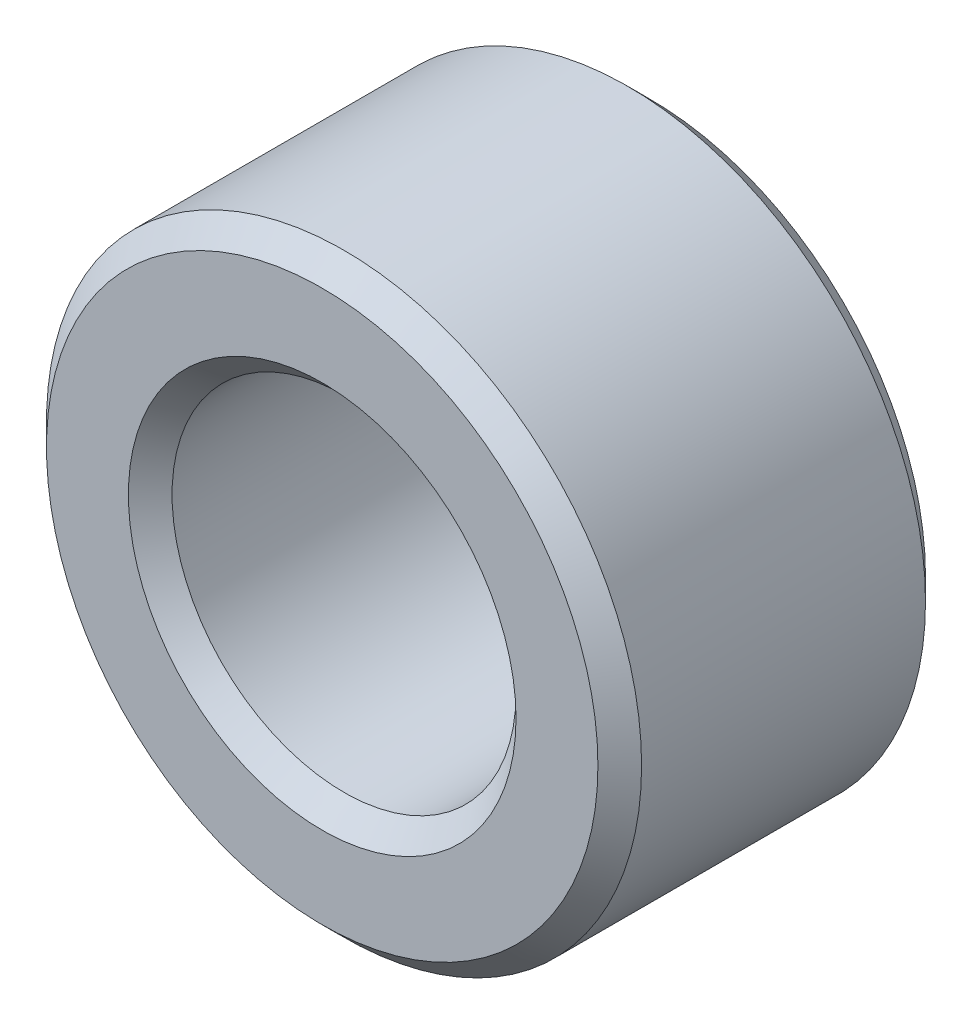
ISO-10303-21;
HEADER;
FILE_DESCRIPTION(('STEP AP214'),'2;1');
FILE_NAME('part.step','',(''),(''),'','','');
FILE_SCHEMA(('AUTOMOTIVE_DESIGN { 1 0 10303 214 1 1 1 1 }'));
ENDSEC;
DATA;
#1=APPLICATION_CONTEXT('core data for automotive mechanical design processes');
#2=APPLICATION_PROTOCOL_DEFINITION('international standard','automotive_design',2000,#1);
#3=PRODUCT_CONTEXT('',#1,'mechanical');
#4=PRODUCT('Part','Part','',(#3));
#5=PRODUCT_RELATED_PRODUCT_CATEGORY('part','',(#4));
#6=PRODUCT_DEFINITION_FORMATION('','',#4);
#7=PRODUCT_DEFINITION_CONTEXT('part definition',#1,'design');
#8=PRODUCT_DEFINITION('design','',#6,#7);
#9=PRODUCT_DEFINITION_SHAPE('','',#8);
#10=(LENGTH_UNIT() NAMED_UNIT(*) SI_UNIT(.MILLI.,.METRE.));
#11=(NAMED_UNIT(*) PLANE_ANGLE_UNIT() SI_UNIT($,.RADIAN.));
#12=(NAMED_UNIT(*) SI_UNIT($,.STERADIAN.) SOLID_ANGLE_UNIT());
#13=UNCERTAINTY_MEASURE_WITH_UNIT(LENGTH_MEASURE(1.E-05),#10,'distance_accuracy_value','');
#14=(GEOMETRIC_REPRESENTATION_CONTEXT(3) GLOBAL_UNCERTAINTY_ASSIGNED_CONTEXT((#13)) GLOBAL_UNIT_ASSIGNED_CONTEXT((#10,
#11,#12)) REPRESENTATION_CONTEXT('',''));
#15=CARTESIAN_POINT('',(0.,0.,0.));
#16=DIRECTION('',(0.,0.,1.));
#17=DIRECTION('',(1.,0.,0.));
#18=AXIS2_PLACEMENT_3D('',#15,#16,#17);
#19=CARTESIAN_POINT('',(0.,0.,3.));
#20=DIRECTION('',(0.,0.,1.));
#21=DIRECTION('',(1.,0.,0.));
#22=AXIS2_PLACEMENT_3D('',#19,#20,#21);
#23=PLANE('',#22);
#24=CARTESIAN_POINT('',(0.,0.,3.));
#25=DIRECTION('',(0.,0.,1.));
#26=DIRECTION('',(1.,0.,0.));
#27=AXIS2_PLACEMENT_3D('',#24,#25,#26);
#28=CIRCLE('',#27,1.775);
#29=CARTESIAN_POINT('',(1.775,0.,3.));
#30=VERTEX_POINT('',#29);
#31=EDGE_CURVE('E48',#30,#30,#28,.F.);
#32=ORIENTED_EDGE('',*,*,#31,.T.);
#33=EDGE_LOOP('',(#32));
#34=FACE_BOUND('',#33,.T.);
#35=CARTESIAN_POINT('',(0.,0.,3.));
#36=DIRECTION('',(0.,0.,1.));
#37=DIRECTION('',(1.,0.,0.));
#38=AXIS2_PLACEMENT_3D('',#35,#36,#37);
#39=CIRCLE('',#38,2.525);
#40=CARTESIAN_POINT('',(2.525,0.,3.));
#41=VERTEX_POINT('',#40);
#42=EDGE_CURVE('E52',#41,#41,#39,.T.);
#43=ORIENTED_EDGE('',*,*,#42,.T.);
#44=EDGE_LOOP('',(#43));
#45=FACE_BOUND('',#44,.T.);
#46=ADVANCED_FACE('F36',(#34,#45),#23,.T.);
#47=CARTESIAN_POINT('',(0.,0.,0.));
#48=DIRECTION('',(0.,0.,1.));
#49=DIRECTION('',(1.,0.,0.));
#50=AXIS2_PLACEMENT_3D('',#47,#48,#49);
#51=PLANE('',#50);
#52=CARTESIAN_POINT('',(0.,0.,0.));
#53=DIRECTION('',(0.,0.,1.));
#54=DIRECTION('',(1.,0.,0.));
#55=AXIS2_PLACEMENT_3D('',#52,#53,#54);
#56=CIRCLE('',#55,1.775);
#57=CARTESIAN_POINT('',(1.775,0.,0.));
#58=VERTEX_POINT('',#57);
#59=EDGE_CURVE('E63',#58,#58,#56,.T.);
#60=ORIENTED_EDGE('',*,*,#59,.T.);
#61=EDGE_LOOP('',(#60));
#62=FACE_BOUND('',#61,.T.);
#63=CARTESIAN_POINT('',(0.,0.,0.));
#64=DIRECTION('',(0.,0.,1.));
#65=DIRECTION('',(1.,0.,0.));
#66=AXIS2_PLACEMENT_3D('',#63,#64,#65);
#67=CIRCLE('',#66,2.525);
#68=CARTESIAN_POINT('',(2.525,0.,0.));
#69=VERTEX_POINT('',#68);
#70=EDGE_CURVE('E66',#69,#69,#67,.F.);
#71=ORIENTED_EDGE('',*,*,#70,.T.);
#72=EDGE_LOOP('',(#71));
#73=FACE_BOUND('',#72,.T.);
#74=ADVANCED_FACE('F70',(#62,#73),#51,.F.);
#75=CARTESIAN_POINT('',(0.,0.,3.));
#76=DIRECTION('',(0.,0.,-1.));
#77=DIRECTION('',(-1.,0.,0.));
#78=AXIS2_PLACEMENT_3D('',#75,#76,#77);
#79=CYLINDRICAL_SURFACE('',#78,2.725);
#80=CARTESIAN_POINT('',(0.,0.,0.2));
#81=DIRECTION('',(0.,0.,1.));
#82=DIRECTION('',(1.,0.,0.));
#83=AXIS2_PLACEMENT_3D('',#80,#81,#82);
#84=CIRCLE('',#83,2.725);
#85=CARTESIAN_POINT('',(2.725,0.,0.2));
#86=VERTEX_POINT('',#85);
#87=EDGE_CURVE('E10',#86,#86,#84,.T.);
#88=ORIENTED_EDGE('',*,*,#87,.T.);
#89=EDGE_LOOP('',(#88));
#90=FACE_BOUND('',#89,.T.);
#91=CARTESIAN_POINT('',(0.,0.,2.8));
#92=DIRECTION('',(0.,0.,1.));
#93=DIRECTION('',(1.,0.,0.));
#94=AXIS2_PLACEMENT_3D('',#91,#92,#93);
#95=CIRCLE('',#94,2.725);
#96=CARTESIAN_POINT('',(2.725,0.,2.8));
#97=VERTEX_POINT('',#96);
#98=EDGE_CURVE('E44',#97,#97,#95,.F.);
#99=ORIENTED_EDGE('',*,*,#98,.T.);
#100=EDGE_LOOP('',(#99));
#101=FACE_BOUND('',#100,.T.);
#102=ADVANCED_FACE('F91',(#90,#101),#79,.T.);
#103=CARTESIAN_POINT('',(0.,0.,3.));
#104=DIRECTION('',(0.,0.,-1.));
#105=DIRECTION('',(-1.,0.,0.));
#106=AXIS2_PLACEMENT_3D('',#103,#104,#105);
#107=CYLINDRICAL_SURFACE('',#106,1.575);
#108=CARTESIAN_POINT('',(0.,0.,0.200000000000001));
#109=DIRECTION('',(0.,0.,1.));
#110=DIRECTION('',(1.,0.,0.));
#111=AXIS2_PLACEMENT_3D('',#108,#109,#110);
#112=CIRCLE('',#111,1.575);
#113=CARTESIAN_POINT('',(1.575,0.,0.200000000000001));
#114=VERTEX_POINT('',#113);
#115=EDGE_CURVE('E57',#114,#114,#112,.F.);
#116=ORIENTED_EDGE('',*,*,#115,.T.);
#117=EDGE_LOOP('',(#116));
#118=FACE_BOUND('',#117,.T.);
#119=CARTESIAN_POINT('',(0.,0.,2.8));
#120=DIRECTION('',(0.,0.,1.));
#121=DIRECTION('',(1.,0.,0.));
#122=AXIS2_PLACEMENT_3D('',#119,#120,#121);
#123=CIRCLE('',#122,1.575);
#124=CARTESIAN_POINT('',(1.575,0.,2.8));
#125=VERTEX_POINT('',#124);
#126=EDGE_CURVE('E60',#125,#125,#123,.T.);
#127=ORIENTED_EDGE('',*,*,#126,.T.);
#128=EDGE_LOOP('',(#127));
#129=FACE_BOUND('',#128,.T.);
#130=ADVANCED_FACE('F96',(#118,#129),#107,.F.);
#131=CARTESIAN_POINT('',(0.,0.,0.));
#132=DIRECTION('',(0.,0.,-1.));
#133=DIRECTION('',(-1.,0.,0.));
#134=AXIS2_PLACEMENT_3D('',#131,#132,#133);
#135=CONICAL_SURFACE('',#134,1.775,0.785398163397448);
#136=ORIENTED_EDGE('',*,*,#115,.F.);
#137=EDGE_LOOP('',(#136));
#138=FACE_BOUND('',#137,.T.);
#139=ORIENTED_EDGE('',*,*,#59,.F.);
#140=EDGE_LOOP('',(#139));
#141=FACE_BOUND('',#140,.T.);
#142=ADVANCED_FACE('F81',(#138,#141),#135,.F.);
#143=CARTESIAN_POINT('',(0.,0.,2.8));
#144=DIRECTION('',(0.,0.,1.));
#145=DIRECTION('',(1.,0.,0.));
#146=AXIS2_PLACEMENT_3D('',#143,#144,#145);
#147=CONICAL_SURFACE('',#146,1.575,0.785398163397452);
#148=CARTESIAN_POINT('',(1.775,0.,3.));
#149=CARTESIAN_POINT('',(1.77291666666667,0.,2.99791666666667));
#150=CARTESIAN_POINT('',(1.77083333333333,0.,2.99583333333333));
#151=CARTESIAN_POINT('',(1.76666666666667,0.,2.99166666666667));
#152=CARTESIAN_POINT('',(1.76458333333333,0.,2.98958333333333));
#153=CARTESIAN_POINT('',(1.76041666666667,0.,2.98541666666667));
#154=CARTESIAN_POINT('',(1.75833333333333,0.,2.98333333333333));
#155=CARTESIAN_POINT('',(1.75416666666667,0.,2.97916666666667));
#156=CARTESIAN_POINT('',(1.75208333333333,0.,2.97708333333333));
#157=CARTESIAN_POINT('',(1.74791666666667,0.,2.97291666666667));
#158=CARTESIAN_POINT('',(1.74583333333333,0.,2.97083333333333));
#159=CARTESIAN_POINT('',(1.74166666666667,0.,2.96666666666667));
#160=CARTESIAN_POINT('',(1.73958333333333,0.,2.96458333333333));
#161=CARTESIAN_POINT('',(1.73541666666667,0.,2.96041666666667));
#162=CARTESIAN_POINT('',(1.73333333333333,0.,2.95833333333333));
#163=CARTESIAN_POINT('',(1.72916666666667,0.,2.95416666666667));
#164=CARTESIAN_POINT('',(1.72708333333333,0.,2.95208333333333));
#165=CARTESIAN_POINT('',(1.72291666666667,0.,2.94791666666667));
#166=CARTESIAN_POINT('',(1.72083333333333,0.,2.94583333333333));
#167=CARTESIAN_POINT('',(1.71666666666667,0.,2.94166666666667));
#168=CARTESIAN_POINT('',(1.71458333333333,0.,2.93958333333333));
#169=CARTESIAN_POINT('',(1.71041666666667,0.,2.93541666666667));
#170=CARTESIAN_POINT('',(1.70833333333333,0.,2.93333333333333));
#171=CARTESIAN_POINT('',(1.70416666666667,0.,2.92916666666667));
#172=CARTESIAN_POINT('',(1.70208333333333,0.,2.92708333333333));
#173=CARTESIAN_POINT('',(1.69791666666667,0.,2.92291666666667));
#174=CARTESIAN_POINT('',(1.69583333333333,0.,2.92083333333333));
#175=CARTESIAN_POINT('',(1.69166666666667,0.,2.91666666666667));
#176=CARTESIAN_POINT('',(1.68958333333333,0.,2.91458333333333));
#177=CARTESIAN_POINT('',(1.68541666666667,0.,2.91041666666667));
#178=CARTESIAN_POINT('',(1.68333333333333,0.,2.90833333333333));
#179=CARTESIAN_POINT('',(1.67916666666667,0.,2.90416666666667));
#180=CARTESIAN_POINT('',(1.67708333333333,0.,2.90208333333333));
#181=CARTESIAN_POINT('',(1.67291666666667,0.,2.89791666666667));
#182=CARTESIAN_POINT('',(1.67083333333333,0.,2.89583333333333));
#183=CARTESIAN_POINT('',(1.66666666666667,0.,2.89166666666667));
#184=CARTESIAN_POINT('',(1.66458333333333,0.,2.88958333333333));
#185=CARTESIAN_POINT('',(1.66041666666667,0.,2.88541666666667));
#186=CARTESIAN_POINT('',(1.65833333333333,0.,2.88333333333333));
#187=CARTESIAN_POINT('',(1.65416666666667,0.,2.87916666666667));
#188=CARTESIAN_POINT('',(1.65208333333333,0.,2.87708333333333));
#189=CARTESIAN_POINT('',(1.64791666666667,0.,2.87291666666667));
#190=CARTESIAN_POINT('',(1.64583333333333,0.,2.87083333333333));
#191=CARTESIAN_POINT('',(1.64166666666667,0.,2.86666666666667));
#192=CARTESIAN_POINT('',(1.63958333333333,0.,2.86458333333333));
#193=CARTESIAN_POINT('',(1.63541666666667,0.,2.86041666666667));
#194=CARTESIAN_POINT('',(1.63333333333333,0.,2.85833333333333));
#195=CARTESIAN_POINT('',(1.62916666666667,0.,2.85416666666667));
#196=CARTESIAN_POINT('',(1.62708333333333,0.,2.85208333333333));
#197=CARTESIAN_POINT('',(1.62291666666667,0.,2.84791666666667));
#198=CARTESIAN_POINT('',(1.62083333333333,0.,2.84583333333333));
#199=CARTESIAN_POINT('',(1.61666666666667,0.,2.84166666666667));
#200=CARTESIAN_POINT('',(1.61458333333333,0.,2.83958333333333));
#201=CARTESIAN_POINT('',(1.61041666666667,0.,2.83541666666667));
#202=CARTESIAN_POINT('',(1.60833333333333,0.,2.83333333333333));
#203=CARTESIAN_POINT('',(1.60416666666667,0.,2.82916666666667));
#204=CARTESIAN_POINT('',(1.60208333333333,0.,2.82708333333333));
#205=CARTESIAN_POINT('',(1.59791666666667,0.,2.82291666666667));
#206=CARTESIAN_POINT('',(1.59583333333333,0.,2.82083333333333));
#207=CARTESIAN_POINT('',(1.59166666666667,0.,2.81666666666667));
#208=CARTESIAN_POINT('',(1.58958333333333,0.,2.81458333333333));
#209=CARTESIAN_POINT('',(1.58541666666667,0.,2.81041666666667));
#210=CARTESIAN_POINT('',(1.58333333333333,0.,2.80833333333333));
#211=CARTESIAN_POINT('',(1.57916666666667,0.,2.80416666666667));
#212=CARTESIAN_POINT('',(1.57708333333333,0.,2.80208333333333));
#213=CARTESIAN_POINT('',(1.575,0.,2.8));
#214=B_SPLINE_CURVE_WITH_KNOTS('',3,(#148,#149,#150,#151,#152,#153,#154,#155,#156,#157,#158,
#159,#160,#161,#162,#163,#164,#165,#166,#167,#168,#169,#170,#171,#172,#173,#174,#175,#176,#177,
#178,#179,#180,#181,#182,#183,#184,#185,#186,#187,#188,#189,#190,#191,#192,#193,#194,#195,#196,
#197,#198,#199,#200,#201,#202,#203,#204,#205,#206,#207,#208,#209,#210,#211,#212,#213),
.UNSPECIFIED.,.F.,.F.,(4,2,2,2,2,2,2,2,2,2,2,2,2,2,2,2,2,2,2,2,2,2,2,2,2,2,2,2,2,2,2,2,4),(0.,
0.00883883476483164,0.0176776695296637,0.0265165042944954,0.0353553390593273,0.0441941738241591,
0.053033008588991,0.061871843353823,0.0707106781186548,0.0795495128834867,0.0883883476483184,
0.0972271824131505,0.106066017177982,0.114904851942814,0.123743686707646,0.132582521472478,
0.14142135623731,0.150260191002142,0.159099025766973,0.167937860531805,0.176776695296637,
0.185615530061469,0.194454364826301,0.203293199591133,0.212132034355965,0.220970869120797,
0.229809703885628,0.23864853865046,0.247487373415292,0.256326208180124,0.265165042944956,
0.274003877709788,0.282842712474619),.UNSPECIFIED.);
#215=EDGE_CURVE('BSEAM75',#30,#125,#214,.T.);
#216=ORIENTED_EDGE('',*,*,#31,.F.);
#217=ORIENTED_EDGE('',*,*,#126,.F.);
#218=ORIENTED_EDGE('',*,*,#215,.T.);
#219=ORIENTED_EDGE('',*,*,#215,.F.);
#220=EDGE_LOOP('',(#216,#218,#217,#219));
#221=FACE_BOUND('',#220,.T.);
#222=ADVANCED_FACE('F75',(#221),#147,.F.);
#223=CARTESIAN_POINT('',(0.,0.,0.2));
#224=DIRECTION('',(0.,0.,1.));
#225=DIRECTION('',(1.,0.,0.));
#226=AXIS2_PLACEMENT_3D('',#223,#224,#225);
#227=CONICAL_SURFACE('',#226,2.725,0.78539816339745);
#228=CARTESIAN_POINT('',(2.525,0.,0.));
#229=CARTESIAN_POINT('',(2.52708333333333,0.,0.00208333333333318));
#230=CARTESIAN_POINT('',(2.52916666666667,0.,0.00416666666666655));
#231=CARTESIAN_POINT('',(2.53333333333333,0.,0.0083333333333333));
#232=CARTESIAN_POINT('',(2.53541666666667,0.,0.0104166666666667));
#233=CARTESIAN_POINT('',(2.53958333333333,0.,0.0145833333333333));
#234=CARTESIAN_POINT('',(2.54166666666667,0.,0.0166666666666666));
#235=CARTESIAN_POINT('',(2.54583333333333,0.,0.0208333333333332));
#236=CARTESIAN_POINT('',(2.54791666666667,0.,0.0229166666666666));
#237=CARTESIAN_POINT('',(2.55208333333333,0.,0.0270833333333333));
#238=CARTESIAN_POINT('',(2.55416666666667,0.,0.0291666666666666));
#239=CARTESIAN_POINT('',(2.55833333333333,0.,0.0333333333333332));
#240=CARTESIAN_POINT('',(2.56041666666667,0.,0.0354166666666665));
#241=CARTESIAN_POINT('',(2.56458333333333,0.,0.0395833333333332));
#242=CARTESIAN_POINT('',(2.56666666666667,0.,0.0416666666666666));
#243=CARTESIAN_POINT('',(2.57083333333333,0.,0.0458333333333333));
#244=CARTESIAN_POINT('',(2.57291666666667,0.,0.0479166666666666));
#245=CARTESIAN_POINT('',(2.57708333333333,0.,0.0520833333333332));
#246=CARTESIAN_POINT('',(2.57916666666667,0.,0.0541666666666665));
#247=CARTESIAN_POINT('',(2.58333333333333,0.,0.0583333333333332));
#248=CARTESIAN_POINT('',(2.58541666666667,0.,0.0604166666666666));
#249=CARTESIAN_POINT('',(2.58958333333333,0.,0.0645833333333332));
#250=CARTESIAN_POINT('',(2.59166666666667,0.,0.0666666666666665));
#251=CARTESIAN_POINT('',(2.59583333333333,0.,0.0708333333333332));
#252=CARTESIAN_POINT('',(2.59791666666667,0.,0.0729166666666665));
#253=CARTESIAN_POINT('',(2.60208333333333,0.,0.0770833333333332));
#254=CARTESIAN_POINT('',(2.60416666666667,0.,0.0791666666666665));
#255=CARTESIAN_POINT('',(2.60833333333333,0.,0.0833333333333331));
#256=CARTESIAN_POINT('',(2.61041666666667,0.,0.0854166666666664));
#257=CARTESIAN_POINT('',(2.61458333333333,0.,0.0895833333333331));
#258=CARTESIAN_POINT('',(2.61666666666667,0.,0.0916666666666665));
#259=CARTESIAN_POINT('',(2.62083333333333,0.,0.0958333333333332));
#260=CARTESIAN_POINT('',(2.62291666666667,0.,0.0979166666666665));
#261=CARTESIAN_POINT('',(2.62708333333333,0.,0.102083333333333));
#262=CARTESIAN_POINT('',(2.62916666666667,0.,0.104166666666666));
#263=CARTESIAN_POINT('',(2.63333333333333,0.,0.108333333333333));
#264=CARTESIAN_POINT('',(2.63541666666667,0.,0.110416666666666));
#265=CARTESIAN_POINT('',(2.63958333333333,0.,0.114583333333333));
#266=CARTESIAN_POINT('',(2.64166666666667,0.,0.116666666666666));
#267=CARTESIAN_POINT('',(2.64583333333333,0.,0.120833333333333));
#268=CARTESIAN_POINT('',(2.64791666666667,0.,0.122916666666666));
#269=CARTESIAN_POINT('',(2.65208333333333,0.,0.127083333333333));
#270=CARTESIAN_POINT('',(2.65416666666667,0.,0.129166666666666));
#271=CARTESIAN_POINT('',(2.65833333333333,0.,0.133333333333333));
#272=CARTESIAN_POINT('',(2.66041666666667,0.,0.135416666666666));
#273=CARTESIAN_POINT('',(2.66458333333333,0.,0.139583333333333));
#274=CARTESIAN_POINT('',(2.66666666666667,0.,0.141666666666666));
#275=CARTESIAN_POINT('',(2.67083333333333,0.,0.145833333333333));
#276=CARTESIAN_POINT('',(2.67291666666667,0.,0.147916666666666));
#277=CARTESIAN_POINT('',(2.67708333333333,0.,0.152083333333333));
#278=CARTESIAN_POINT('',(2.67916666666667,0.,0.154166666666666));
#279=CARTESIAN_POINT('',(2.68333333333333,0.,0.158333333333333));
#280=CARTESIAN_POINT('',(2.68541666666667,0.,0.160416666666666));
#281=CARTESIAN_POINT('',(2.68958333333333,0.,0.164583333333333));
#282=CARTESIAN_POINT('',(2.69166666666667,0.,0.166666666666666));
#283=CARTESIAN_POINT('',(2.69583333333333,0.,0.170833333333333));
#284=CARTESIAN_POINT('',(2.69791666666667,0.,0.172916666666666));
#285=CARTESIAN_POINT('',(2.70208333333333,0.,0.177083333333333));
#286=CARTESIAN_POINT('',(2.70416666666667,0.,0.179166666666666));
#287=CARTESIAN_POINT('',(2.70833333333333,0.,0.183333333333333));
#288=CARTESIAN_POINT('',(2.71041666666667,0.,0.185416666666666));
#289=CARTESIAN_POINT('',(2.71458333333333,0.,0.189583333333333));
#290=CARTESIAN_POINT('',(2.71666666666667,0.,0.191666666666666));
#291=CARTESIAN_POINT('',(2.72083333333333,0.,0.195833333333333));
#292=CARTESIAN_POINT('',(2.72291666666667,0.,0.197916666666666));
#293=CARTESIAN_POINT('',(2.725,0.,0.2));
#294=B_SPLINE_CURVE_WITH_KNOTS('',3,(#228,#229,#230,#231,#232,#233,#234,#235,#236,#237,#238,
#239,#240,#241,#242,#243,#244,#245,#246,#247,#248,#249,#250,#251,#252,#253,#254,#255,#256,#257,
#258,#259,#260,#261,#262,#263,#264,#265,#266,#267,#268,#269,#270,#271,#272,#273,#274,#275,#276,
#277,#278,#279,#280,#281,#282,#283,#284,#285,#286,#287,#288,#289,#290,#291,#292,#293),
.UNSPECIFIED.,.F.,.F.,(4,2,2,2,2,2,2,2,2,2,2,2,2,2,2,2,2,2,2,2,2,2,2,2,2,2,2,2,2,2,2,2,4),(0.,
0.00883883476483196,0.0176776695296636,0.0265165042944956,0.0353553390593272,0.0441941738241592,
0.0530330085889912,0.0618718433538228,0.0707106781186548,0.0795495128834867,0.0883883476483184,
0.0972271824131504,0.106066017177982,0.114904851942814,0.123743686707646,0.132582521472478,
0.14142135623731,0.150260191002142,0.159099025766973,0.167937860531805,0.176776695296637,
0.185615530061469,0.194454364826301,0.203293199591132,0.212132034355964,0.220970869120796,
0.229809703885628,0.23864853865046,0.247487373415292,0.256326208180124,0.265165042944956,
0.274003877709787,0.282842712474619),.UNSPECIFIED.);
#295=EDGE_CURVE('BSEAM72',#69,#86,#294,.T.);
#296=ORIENTED_EDGE('',*,*,#70,.F.);
#297=ORIENTED_EDGE('',*,*,#87,.F.);
#298=ORIENTED_EDGE('',*,*,#295,.T.);
#299=ORIENTED_EDGE('',*,*,#295,.F.);
#300=EDGE_LOOP('',(#296,#298,#297,#299));
#301=FACE_BOUND('',#300,.T.);
#302=ADVANCED_FACE('F72',(#301),#227,.T.);
#303=CARTESIAN_POINT('',(0.,0.,3.));
#304=DIRECTION('',(0.,0.,-1.));
#305=DIRECTION('',(-1.,0.,0.));
#306=AXIS2_PLACEMENT_3D('',#303,#304,#305);
#307=CONICAL_SURFACE('',#306,2.525,0.785398163397443);
#308=ORIENTED_EDGE('',*,*,#98,.F.);
#309=EDGE_LOOP('',(#308));
#310=FACE_BOUND('',#309,.T.);
#311=ORIENTED_EDGE('',*,*,#42,.F.);
#312=EDGE_LOOP('',(#311));
#313=FACE_BOUND('',#312,.T.);
#314=ADVANCED_FACE('F39',(#310,#313),#307,.T.);
#315=CLOSED_SHELL('',(#46,#74,#102,#130,#142,#222,#302,#314));
#316=MANIFOLD_SOLID_BREP('B2',#315);
#317=ADVANCED_BREP_SHAPE_REPRESENTATION('',(#18,#316),#14);
#318=SHAPE_DEFINITION_REPRESENTATION(#9,#317);
ENDSEC;
END-ISO-10303-21;
